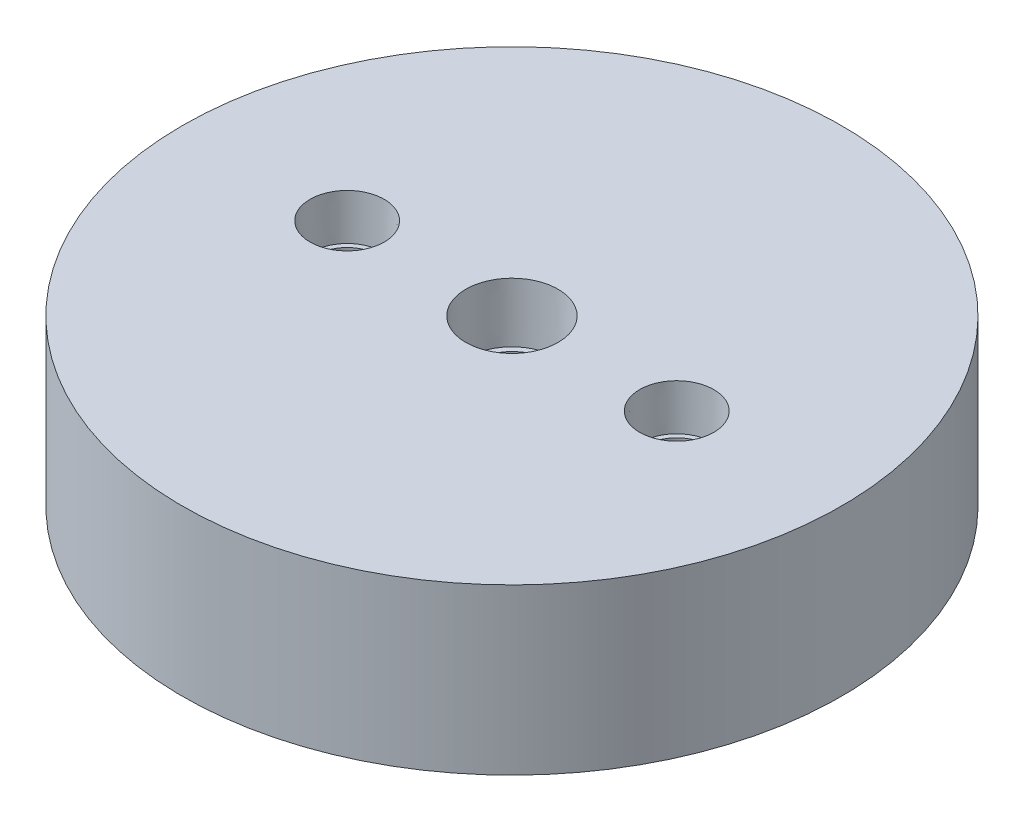
ISO-10303-21;
HEADER;
FILE_DESCRIPTION(('STEP AP214'),'2;1');
FILE_NAME('part.step','',(''),(''),'','','');
FILE_SCHEMA(('AUTOMOTIVE_DESIGN { 1 0 10303 214 1 1 1 1 }'));
ENDSEC;
DATA;
#1=APPLICATION_CONTEXT('core data for automotive mechanical design processes');
#2=APPLICATION_PROTOCOL_DEFINITION('international standard','automotive_design',2000,#1);
#3=PRODUCT_CONTEXT('',#1,'mechanical');
#4=PRODUCT('Part','Part','',(#3));
#5=PRODUCT_RELATED_PRODUCT_CATEGORY('part','',(#4));
#6=PRODUCT_DEFINITION_FORMATION('','',#4);
#7=PRODUCT_DEFINITION_CONTEXT('part definition',#1,'design');
#8=PRODUCT_DEFINITION('design','',#6,#7);
#9=PRODUCT_DEFINITION_SHAPE('','',#8);
#10=(LENGTH_UNIT() NAMED_UNIT(*) SI_UNIT(.MILLI.,.METRE.));
#11=(NAMED_UNIT(*) PLANE_ANGLE_UNIT() SI_UNIT($,.RADIAN.));
#12=(NAMED_UNIT(*) SI_UNIT($,.STERADIAN.) SOLID_ANGLE_UNIT());
#13=UNCERTAINTY_MEASURE_WITH_UNIT(LENGTH_MEASURE(1.E-05),#10,'distance_accuracy_value','');
#14=(GEOMETRIC_REPRESENTATION_CONTEXT(3) GLOBAL_UNCERTAINTY_ASSIGNED_CONTEXT((#13)) GLOBAL_UNIT_ASSIGNED_CONTEXT((#10,
#11,#12)) REPRESENTATION_CONTEXT('',''));
#15=CARTESIAN_POINT('',(0.,0.,0.));
#16=DIRECTION('',(0.,0.,1.));
#17=DIRECTION('',(1.,0.,0.));
#18=AXIS2_PLACEMENT_3D('',#15,#16,#17);
#19=CARTESIAN_POINT('',(0.,0.,0.));
#20=DIRECTION('',(0.,1.,0.));
#21=DIRECTION('',(-1.,0.,0.));
#22=AXIS2_PLACEMENT_3D('',#19,#20,#21);
#23=CYLINDRICAL_SURFACE('',#22,60.96);
#24=CARTESIAN_POINT('',(0.,-32.258,0.));
#25=DIRECTION('',(0.,1.,0.));
#26=DIRECTION('',(-1.,0.,0.));
#27=AXIS2_PLACEMENT_3D('',#24,#25,#26);
#28=CIRCLE('',#27,60.96);
#29=CARTESIAN_POINT('',(-60.96,-32.258,0.));
#30=VERTEX_POINT('',#29);
#31=EDGE_CURVE('E53',#30,#30,#28,.T.);
#32=ORIENTED_EDGE('',*,*,#31,.T.);
#33=EDGE_LOOP('',(#32));
#34=FACE_BOUND('',#33,.T.);
#35=CARTESIAN_POINT('',(0.,-38.1,0.));
#36=DIRECTION('',(0.,1.,0.));
#37=DIRECTION('',(-1.,0.,0.));
#38=AXIS2_PLACEMENT_3D('',#35,#36,#37);
#39=CIRCLE('',#38,60.96);
#40=CARTESIAN_POINT('',(-60.96,-38.1,0.));
#41=VERTEX_POINT('',#40);
#42=EDGE_CURVE('E10',#41,#41,#39,.T.);
#43=ORIENTED_EDGE('',*,*,#42,.F.);
#44=EDGE_LOOP('',(#43));
#45=FACE_BOUND('',#44,.T.);
#46=ADVANCED_FACE('F35',(#34,#45),#23,.F.);
#47=CARTESIAN_POINT('',(-76.2,-38.1,0.));
#48=DIRECTION('',(0.,-1.,0.));
#49=DIRECTION('',(1.,0.,0.));
#50=AXIS2_PLACEMENT_3D('',#47,#48,#49);
#51=PLANE('',#50);
#52=ORIENTED_EDGE('',*,*,#42,.T.);
#53=EDGE_LOOP('',(#52));
#54=FACE_BOUND('',#53,.T.);
#55=CARTESIAN_POINT('',(0.,-38.1,0.));
#56=DIRECTION('',(0.,1.,0.));
#57=DIRECTION('',(-1.,0.,0.));
#58=AXIS2_PLACEMENT_3D('',#55,#56,#57);
#59=CIRCLE('',#58,76.2);
#60=CARTESIAN_POINT('',(-76.2,-38.1,0.));
#61=VERTEX_POINT('',#60);
#62=EDGE_CURVE('E42',#61,#61,#59,.T.);
#63=ORIENTED_EDGE('',*,*,#62,.F.);
#64=EDGE_LOOP('',(#63));
#65=FACE_BOUND('',#64,.T.);
#66=ADVANCED_FACE('F95',(#54,#65),#51,.T.);
#67=CARTESIAN_POINT('',(0.,0.,0.));
#68=DIRECTION('',(0.,1.,0.));
#69=DIRECTION('',(-1.,0.,0.));
#70=AXIS2_PLACEMENT_3D('',#67,#68,#69);
#71=CYLINDRICAL_SURFACE('',#70,76.2);
#72=ORIENTED_EDGE('',*,*,#62,.T.);
#73=EDGE_LOOP('',(#72));
#74=FACE_BOUND('',#73,.T.);
#75=CARTESIAN_POINT('',(0.,0.,0.));
#76=DIRECTION('',(0.,1.,0.));
#77=DIRECTION('',(-1.,0.,0.));
#78=AXIS2_PLACEMENT_3D('',#75,#76,#77);
#79=CIRCLE('',#78,76.2);
#80=CARTESIAN_POINT('',(-76.2,0.,0.));
#81=VERTEX_POINT('',#80);
#82=EDGE_CURVE('E47',#81,#81,#79,.T.);
#83=ORIENTED_EDGE('',*,*,#82,.F.);
#84=EDGE_LOOP('',(#83));
#85=FACE_BOUND('',#84,.T.);
#86=ADVANCED_FACE('F93',(#74,#85),#71,.T.);
#87=CARTESIAN_POINT('',(0.,0.,0.));
#88=DIRECTION('',(0.,1.,0.));
#89=DIRECTION('',(-1.,0.,0.));
#90=AXIS2_PLACEMENT_3D('',#87,#88,#89);
#91=PLANE('',#90);
#92=CARTESIAN_POINT('',(-38.1,0.,0.));
#93=DIRECTION('',(0.,1.,0.));
#94=DIRECTION('',(0.,0.,1.));
#95=AXIS2_PLACEMENT_3D('',#92,#93,#94);
#96=CIRCLE('',#95,8.5750146);
#97=CARTESIAN_POINT('',(-38.1,0.,8.5750146));
#98=VERTEX_POINT('',#97);
#99=EDGE_CURVE('E193',#98,#98,#96,.T.);
#100=ORIENTED_EDGE('',*,*,#99,.F.);
#101=EDGE_LOOP('',(#100));
#102=FACE_BOUND('',#101,.T.);
#103=CARTESIAN_POINT('',(38.1,0.,0.));
#104=DIRECTION('',(0.,1.,0.));
#105=DIRECTION('',(0.,0.,1.));
#106=AXIS2_PLACEMENT_3D('',#103,#104,#105);
#107=CIRCLE('',#106,8.5750146);
#108=CARTESIAN_POINT('',(38.1,0.,8.5750146));
#109=VERTEX_POINT('',#108);
#110=EDGE_CURVE('E70',#109,#109,#107,.T.);
#111=ORIENTED_EDGE('',*,*,#110,.F.);
#112=EDGE_LOOP('',(#111));
#113=FACE_BOUND('',#112,.T.);
#114=CARTESIAN_POINT('',(0.,0.,0.));
#115=DIRECTION('',(0.,1.,0.));
#116=DIRECTION('',(0.,0.,1.));
#117=AXIS2_PLACEMENT_3D('',#114,#115,#116);
#118=CIRCLE('',#117,10.6647361);
#119=CARTESIAN_POINT('',(0.,0.,10.6647361));
#120=VERTEX_POINT('',#119);
#121=EDGE_CURVE('E57',#120,#120,#118,.T.);
#122=ORIENTED_EDGE('',*,*,#121,.F.);
#123=EDGE_LOOP('',(#122));
#124=FACE_BOUND('',#123,.T.);
#125=ORIENTED_EDGE('',*,*,#82,.T.);
#126=EDGE_LOOP('',(#125));
#127=FACE_BOUND('',#126,.T.);
#128=ADVANCED_FACE('F91',(#102,#113,#124,#127),#91,.T.);
#129=CARTESIAN_POINT('',(0.,-27.178,0.));
#130=DIRECTION('',(0.,-1.,0.));
#131=DIRECTION('',(1.,0.,0.));
#132=AXIS2_PLACEMENT_3D('',#129,#130,#131);
#133=CONICAL_SURFACE('',#132,22.225,1.09967971244947);
#134=CARTESIAN_POINT('',(0.,-20.4049390514286,0.));
#135=DIRECTION('',(0.,-1.,0.));
#136=DIRECTION('',(1.,0.,0.));
#137=AXIS2_PLACEMENT_3D('',#134,#135,#136);
#138=CIRCLE('',#137,8.9281);
#139=CARTESIAN_POINT('',(8.9281,-20.4049390514286,0.));
#140=VERTEX_POINT('',#139);
#141=EDGE_CURVE('E51',#140,#140,#138,.T.);
#142=ORIENTED_EDGE('',*,*,#141,.F.);
#143=EDGE_LOOP('',(#142));
#144=FACE_BOUND('',#143,.T.);
#145=CARTESIAN_POINT('',(0.,-27.178,0.));
#146=DIRECTION('',(0.,1.,0.));
#147=DIRECTION('',(-1.,0.,0.));
#148=AXIS2_PLACEMENT_3D('',#145,#146,#147);
#149=CIRCLE('',#148,22.225);
#150=CARTESIAN_POINT('',(-22.225,-27.178,0.));
#151=VERTEX_POINT('',#150);
#152=EDGE_CURVE('E86',#151,#151,#149,.T.);
#153=ORIENTED_EDGE('',*,*,#152,.F.);
#154=EDGE_LOOP('',(#153));
#155=FACE_BOUND('',#154,.T.);
#156=ADVANCED_FACE('F102',(#144,#155),#133,.F.);
#157=CARTESIAN_POINT('',(-28.575,-27.178,0.));
#158=DIRECTION('',(0.,-1.,0.));
#159=DIRECTION('',(1.,0.,0.));
#160=AXIS2_PLACEMENT_3D('',#157,#158,#159);
#161=PLANE('',#160);
#162=ORIENTED_EDGE('',*,*,#152,.T.);
#163=EDGE_LOOP('',(#162));
#164=FACE_BOUND('',#163,.T.);
#165=CARTESIAN_POINT('',(0.,-27.178,0.));
#166=DIRECTION('',(0.,1.,0.));
#167=DIRECTION('',(-1.,0.,0.));
#168=AXIS2_PLACEMENT_3D('',#165,#166,#167);
#169=CIRCLE('',#168,28.575);
#170=CARTESIAN_POINT('',(-28.575,-27.178,0.));
#171=VERTEX_POINT('',#170);
#172=EDGE_CURVE('E83',#171,#171,#169,.T.);
#173=ORIENTED_EDGE('',*,*,#172,.F.);
#174=EDGE_LOOP('',(#173));
#175=FACE_BOUND('',#174,.T.);
#176=ADVANCED_FACE('F125',(#164,#175),#161,.T.);
#177=CARTESIAN_POINT('',(0.,0.,0.));
#178=DIRECTION('',(0.,1.,0.));
#179=DIRECTION('',(-1.,0.,0.));
#180=AXIS2_PLACEMENT_3D('',#177,#178,#179);
#181=CYLINDRICAL_SURFACE('',#180,28.575);
#182=ORIENTED_EDGE('',*,*,#172,.T.);
#183=EDGE_LOOP('',(#182));
#184=FACE_BOUND('',#183,.T.);
#185=CARTESIAN_POINT('',(0.,-32.258,0.));
#186=DIRECTION('',(0.,1.,0.));
#187=DIRECTION('',(-1.,0.,0.));
#188=AXIS2_PLACEMENT_3D('',#185,#186,#187);
#189=CIRCLE('',#188,28.575);
#190=CARTESIAN_POINT('',(-28.575,-32.258,0.));
#191=VERTEX_POINT('',#190);
#192=EDGE_CURVE('E80',#191,#191,#189,.T.);
#193=ORIENTED_EDGE('',*,*,#192,.F.);
#194=EDGE_LOOP('',(#193));
#195=FACE_BOUND('',#194,.T.);
#196=ADVANCED_FACE('F115',(#184,#195),#181,.F.);
#197=CARTESIAN_POINT('',(-60.96,-32.258,0.));
#198=DIRECTION('',(0.,-1.,0.));
#199=DIRECTION('',(1.,0.,0.));
#200=AXIS2_PLACEMENT_3D('',#197,#198,#199);
#201=PLANE('',#200);
#202=CARTESIAN_POINT('',(-38.1,-32.258,0.));
#203=DIRECTION('',(0.,-1.,0.));
#204=DIRECTION('',(1.,0.,0.));
#205=AXIS2_PLACEMENT_3D('',#202,#203,#204);
#206=CIRCLE('',#205,7.1374);
#207=CARTESIAN_POINT('',(-30.9626,-32.258,0.));
#208=VERTEX_POINT('',#207);
#209=EDGE_CURVE('E38',#208,#208,#206,.T.);
#210=ORIENTED_EDGE('',*,*,#209,.F.);
#211=EDGE_LOOP('',(#210));
#212=FACE_BOUND('',#211,.T.);
#213=CARTESIAN_POINT('',(38.1,-32.258,0.));
#214=DIRECTION('',(0.,-1.,0.));
#215=DIRECTION('',(1.,0.,0.));
#216=AXIS2_PLACEMENT_3D('',#213,#214,#215);
#217=CIRCLE('',#216,7.13740000000001);
#218=CARTESIAN_POINT('',(45.2374,-32.258,0.));
#219=VERTEX_POINT('',#218);
#220=EDGE_CURVE('E55',#219,#219,#217,.T.);
#221=ORIENTED_EDGE('',*,*,#220,.F.);
#222=EDGE_LOOP('',(#221));
#223=FACE_BOUND('',#222,.T.);
#224=ORIENTED_EDGE('',*,*,#192,.T.);
#225=EDGE_LOOP('',(#224));
#226=FACE_BOUND('',#225,.T.);
#227=ORIENTED_EDGE('',*,*,#31,.F.);
#228=EDGE_LOOP('',(#227));
#229=FACE_BOUND('',#228,.T.);
#230=ADVANCED_FACE('F112',(#212,#223,#226,#229),#201,.T.);
#231=CARTESIAN_POINT('',(0.,0.,0.));
#232=DIRECTION('',(0.,1.,0.));
#233=DIRECTION('',(0.,0.,1.));
#234=AXIS2_PLACEMENT_3D('',#231,#232,#233);
#235=CYLINDRICAL_SURFACE('',#234,8.9281);
#236=ORIENTED_EDGE('',*,*,#141,.T.);
#237=EDGE_LOOP('',(#236));
#238=FACE_BOUND('',#237,.T.);
#239=CARTESIAN_POINT('',(0.,-13.462,0.));
#240=DIRECTION('',(0.,1.,0.));
#241=DIRECTION('',(0.,0.,1.));
#242=AXIS2_PLACEMENT_3D('',#239,#240,#241);
#243=CIRCLE('',#242,8.9281);
#244=CARTESIAN_POINT('',(0.,-13.462,8.9281));
#245=VERTEX_POINT('',#244);
#246=EDGE_CURVE('E54',#245,#245,#243,.T.);
#247=ORIENTED_EDGE('',*,*,#246,.T.);
#248=EDGE_LOOP('',(#247));
#249=FACE_BOUND('',#248,.T.);
#250=ADVANCED_FACE('F114',(#238,#249),#235,.F.);
#251=CARTESIAN_POINT('',(8.9281,-13.462,0.));
#252=DIRECTION('',(0.,-1.,0.));
#253=DIRECTION('',(0.,0.,-1.));
#254=AXIS2_PLACEMENT_3D('',#251,#252,#253);
#255=PLANE('',#254);
#256=ORIENTED_EDGE('',*,*,#246,.F.);
#257=EDGE_LOOP('',(#256));
#258=FACE_BOUND('',#257,.T.);
#259=CARTESIAN_POINT('',(0.,-13.462,0.));
#260=DIRECTION('',(0.,1.,0.));
#261=DIRECTION('',(0.,0.,1.));
#262=AXIS2_PLACEMENT_3D('',#259,#260,#261);
#263=CIRCLE('',#262,10.2616657920863);
#264=CARTESIAN_POINT('',(0.,-13.462,10.2616657920863));
#265=VERTEX_POINT('',#264);
#266=EDGE_CURVE('E62',#265,#265,#263,.T.);
#267=ORIENTED_EDGE('',*,*,#266,.T.);
#268=EDGE_LOOP('',(#267));
#269=FACE_BOUND('',#268,.T.);
#270=ADVANCED_FACE('F122',(#258,#269),#255,.F.);
#271=CARTESIAN_POINT('',(0.,0.,0.));
#272=DIRECTION('',(0.,1.,0.));
#273=DIRECTION('',(0.,0.,1.));
#274=AXIS2_PLACEMENT_3D('',#271,#272,#273);
#275=CONICAL_SURFACE('',#274,10.6647361,0.0299323966717028);
#276=ORIENTED_EDGE('',*,*,#266,.F.);
#277=EDGE_LOOP('',(#276));
#278=FACE_BOUND('',#277,.T.);
#279=ORIENTED_EDGE('',*,*,#121,.T.);
#280=EDGE_LOOP('',(#279));
#281=FACE_BOUND('',#280,.T.);
#282=ADVANCED_FACE('F152',(#278,#281),#275,.F.);
#283=CARTESIAN_POINT('',(38.1,0.,0.));
#284=DIRECTION('',(0.,1.,0.));
#285=DIRECTION('',(0.,0.,1.));
#286=AXIS2_PLACEMENT_3D('',#283,#284,#285);
#287=CYLINDRICAL_SURFACE('',#286,7.13740000000001);
#288=ORIENTED_EDGE('',*,*,#220,.T.);
#289=EDGE_LOOP('',(#288));
#290=FACE_BOUND('',#289,.T.);
#291=CARTESIAN_POINT('',(38.1,-10.414,0.));
#292=DIRECTION('',(0.,1.,0.));
#293=DIRECTION('',(0.,0.,1.));
#294=AXIS2_PLACEMENT_3D('',#291,#292,#293);
#295=CIRCLE('',#294,7.1374);
#296=CARTESIAN_POINT('',(38.1,-10.414,7.1374));
#297=VERTEX_POINT('',#296);
#298=EDGE_CURVE('E58',#297,#297,#295,.T.);
#299=ORIENTED_EDGE('',*,*,#298,.T.);
#300=EDGE_LOOP('',(#299));
#301=FACE_BOUND('',#300,.T.);
#302=ADVANCED_FACE('F157',(#290,#301),#287,.F.);
#303=CARTESIAN_POINT('',(45.2374,-10.414,0.));
#304=DIRECTION('',(0.,-1.,0.));
#305=DIRECTION('',(0.,0.,-1.));
#306=AXIS2_PLACEMENT_3D('',#303,#304,#305);
#307=PLANE('',#306);
#308=ORIENTED_EDGE('',*,*,#298,.F.);
#309=EDGE_LOOP('',(#308));
#310=FACE_BOUND('',#309,.T.);
#311=CARTESIAN_POINT('',(38.1,-10.414,0.));
#312=DIRECTION('',(0.,1.,0.));
#313=DIRECTION('',(0.,0.,1.));
#314=AXIS2_PLACEMENT_3D('',#311,#312,#313);
#315=CIRCLE('',#314,8.26320549387809);
#316=CARTESIAN_POINT('',(38.1,-10.414,8.26320549387809));
#317=VERTEX_POINT('',#316);
#318=EDGE_CURVE('E65',#317,#317,#315,.T.);
#319=ORIENTED_EDGE('',*,*,#318,.T.);
#320=EDGE_LOOP('',(#319));
#321=FACE_BOUND('',#320,.T.);
#322=ADVANCED_FACE('F164',(#310,#321),#307,.F.);
#323=CARTESIAN_POINT('',(38.1,0.,0.));
#324=DIRECTION('',(0.,1.,0.));
#325=DIRECTION('',(0.,0.,1.));
#326=AXIS2_PLACEMENT_3D('',#323,#324,#325);
#327=CONICAL_SURFACE('',#326,8.5750146,0.0299323966717029);
#328=ORIENTED_EDGE('',*,*,#318,.F.);
#329=EDGE_LOOP('',(#328));
#330=FACE_BOUND('',#329,.T.);
#331=ORIENTED_EDGE('',*,*,#110,.T.);
#332=EDGE_LOOP('',(#331));
#333=FACE_BOUND('',#332,.T.);
#334=ADVANCED_FACE('F169',(#330,#333),#327,.F.);
#335=CARTESIAN_POINT('',(-38.1,0.,0.));
#336=DIRECTION('',(0.,1.,0.));
#337=DIRECTION('',(0.,0.,1.));
#338=AXIS2_PLACEMENT_3D('',#335,#336,#337);
#339=CYLINDRICAL_SURFACE('',#338,7.1374);
#340=ORIENTED_EDGE('',*,*,#209,.T.);
#341=EDGE_LOOP('',(#340));
#342=FACE_BOUND('',#341,.T.);
#343=CARTESIAN_POINT('',(-38.1,-10.414,0.));
#344=DIRECTION('',(0.,1.,0.));
#345=DIRECTION('',(0.,0.,1.));
#346=AXIS2_PLACEMENT_3D('',#343,#344,#345);
#347=CIRCLE('',#346,7.1374);
#348=CARTESIAN_POINT('',(-38.1,-10.414,7.1374));
#349=VERTEX_POINT('',#348);
#350=EDGE_CURVE('E195',#349,#349,#347,.T.);
#351=ORIENTED_EDGE('',*,*,#350,.T.);
#352=EDGE_LOOP('',(#351));
#353=FACE_BOUND('',#352,.T.);
#354=ADVANCED_FACE('F173',(#342,#353),#339,.F.);
#355=CARTESIAN_POINT('',(-30.9626,-10.414,0.));
#356=DIRECTION('',(0.,-1.,0.));
#357=DIRECTION('',(0.,0.,-1.));
#358=AXIS2_PLACEMENT_3D('',#355,#356,#357);
#359=PLANE('',#358);
#360=ORIENTED_EDGE('',*,*,#350,.F.);
#361=EDGE_LOOP('',(#360));
#362=FACE_BOUND('',#361,.T.);
#363=CARTESIAN_POINT('',(-38.1,-10.414,0.));
#364=DIRECTION('',(0.,1.,0.));
#365=DIRECTION('',(0.,0.,1.));
#366=AXIS2_PLACEMENT_3D('',#363,#364,#365);
#367=CIRCLE('',#366,8.26320549387809);
#368=CARTESIAN_POINT('',(-38.1,-10.414,8.26320549387809));
#369=VERTEX_POINT('',#368);
#370=EDGE_CURVE('E190',#369,#369,#367,.T.);
#371=ORIENTED_EDGE('',*,*,#370,.T.);
#372=EDGE_LOOP('',(#371));
#373=FACE_BOUND('',#372,.T.);
#374=ADVANCED_FACE('F177',(#362,#373),#359,.F.);
#375=CARTESIAN_POINT('',(-38.1,0.,0.));
#376=DIRECTION('',(0.,1.,0.));
#377=DIRECTION('',(0.,0.,1.));
#378=AXIS2_PLACEMENT_3D('',#375,#376,#377);
#379=CONICAL_SURFACE('',#378,8.5750146,0.0299323966717029);
#380=ORIENTED_EDGE('',*,*,#370,.F.);
#381=EDGE_LOOP('',(#380));
#382=FACE_BOUND('',#381,.T.);
#383=ORIENTED_EDGE('',*,*,#99,.T.);
#384=EDGE_LOOP('',(#383));
#385=FACE_BOUND('',#384,.T.);
#386=ADVANCED_FACE('F181',(#382,#385),#379,.F.);
#387=CLOSED_SHELL('',(#46,#66,#86,#128,#156,#176,#196,#230,#250,#270,#282,#302,#322,#334,#354,
#374,#386));
#388=MANIFOLD_SOLID_BREP('B2',#387);
#389=ADVANCED_BREP_SHAPE_REPRESENTATION('',(#18,#388),#14);
#390=SHAPE_DEFINITION_REPRESENTATION(#9,#389);
ENDSEC;
END-ISO-10303-21;
